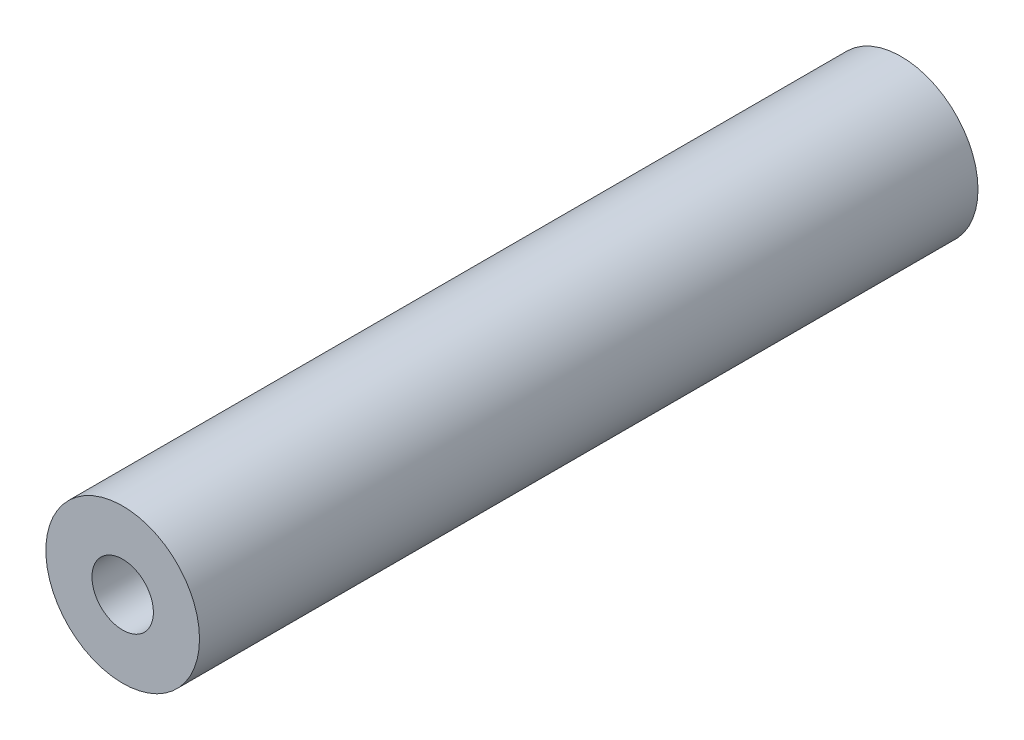
ISO-10303-21;
HEADER;
FILE_DESCRIPTION(('STEP AP214'),'2;1');
FILE_NAME('part.step','',(''),(''),'','','');
FILE_SCHEMA(('AUTOMOTIVE_DESIGN { 1 0 10303 214 1 1 1 1 }'));
ENDSEC;
DATA;
#1=APPLICATION_CONTEXT('core data for automotive mechanical design processes');
#2=APPLICATION_PROTOCOL_DEFINITION('international standard','automotive_design',2000,#1);
#3=PRODUCT_CONTEXT('',#1,'mechanical');
#4=PRODUCT('Part','Part','',(#3));
#5=PRODUCT_RELATED_PRODUCT_CATEGORY('part','',(#4));
#6=PRODUCT_DEFINITION_FORMATION('','',#4);
#7=PRODUCT_DEFINITION_CONTEXT('part definition',#1,'design');
#8=PRODUCT_DEFINITION('design','',#6,#7);
#9=PRODUCT_DEFINITION_SHAPE('','',#8);
#10=(LENGTH_UNIT() NAMED_UNIT(*) SI_UNIT(.MILLI.,.METRE.));
#11=(NAMED_UNIT(*) PLANE_ANGLE_UNIT() SI_UNIT($,.RADIAN.));
#12=(NAMED_UNIT(*) SI_UNIT($,.STERADIAN.) SOLID_ANGLE_UNIT());
#13=UNCERTAINTY_MEASURE_WITH_UNIT(LENGTH_MEASURE(1.E-05),#10,'distance_accuracy_value','');
#14=(GEOMETRIC_REPRESENTATION_CONTEXT(3) GLOBAL_UNCERTAINTY_ASSIGNED_CONTEXT((#13)) GLOBAL_UNIT_ASSIGNED_CONTEXT((#10,
#11,#12)) REPRESENTATION_CONTEXT('',''));
#15=CARTESIAN_POINT('',(0.,0.,0.));
#16=DIRECTION('',(0.,0.,1.));
#17=DIRECTION('',(1.,0.,0.));
#18=AXIS2_PLACEMENT_3D('',#15,#16,#17);
#19=CARTESIAN_POINT('',(0.,0.,152.));
#20=DIRECTION('',(0.,0.,-1.));
#21=DIRECTION('',(-1.,0.,0.));
#22=AXIS2_PLACEMENT_3D('',#19,#20,#21);
#23=CYLINDRICAL_SURFACE('',#22,15.);
#24=CARTESIAN_POINT('',(0.,0.,152.));
#25=DIRECTION('',(0.,0.,1.));
#26=DIRECTION('',(1.,0.,0.));
#27=AXIS2_PLACEMENT_3D('',#24,#25,#26);
#28=CIRCLE('',#27,15.);
#29=CARTESIAN_POINT('',(15.,0.,152.));
#30=VERTEX_POINT('',#29);
#31=EDGE_CURVE('E10',#30,#30,#28,.T.);
#32=ORIENTED_EDGE('',*,*,#31,.F.);
#33=EDGE_LOOP('',(#32));
#34=FACE_BOUND('',#33,.T.);
#35=CARTESIAN_POINT('',(0.,0.,0.));
#36=DIRECTION('',(0.,0.,1.));
#37=DIRECTION('',(1.,0.,0.));
#38=AXIS2_PLACEMENT_3D('',#35,#36,#37);
#39=CIRCLE('',#38,15.);
#40=CARTESIAN_POINT('',(15.,0.,0.));
#41=VERTEX_POINT('',#40);
#42=EDGE_CURVE('E34',#41,#41,#39,.T.);
#43=ORIENTED_EDGE('',*,*,#42,.T.);
#44=EDGE_LOOP('',(#43));
#45=FACE_BOUND('',#44,.T.);
#46=ADVANCED_FACE('F31',(#34,#45),#23,.T.);
#47=CARTESIAN_POINT('',(0.,0.,152.));
#48=DIRECTION('',(0.,0.,1.));
#49=DIRECTION('',(1.,0.,0.));
#50=AXIS2_PLACEMENT_3D('',#47,#48,#49);
#51=PLANE('',#50);
#52=CARTESIAN_POINT('',(0.,0.,152.));
#53=DIRECTION('',(0.,0.,1.));
#54=DIRECTION('',(1.,0.,0.));
#55=AXIS2_PLACEMENT_3D('',#52,#53,#54);
#56=CIRCLE('',#55,6.);
#57=CARTESIAN_POINT('',(6.,0.,152.));
#58=VERTEX_POINT('',#57);
#59=EDGE_CURVE('E49',#58,#58,#56,.T.);
#60=ORIENTED_EDGE('',*,*,#59,.F.);
#61=EDGE_LOOP('',(#60));
#62=FACE_BOUND('',#61,.T.);
#63=ORIENTED_EDGE('',*,*,#31,.T.);
#64=EDGE_LOOP('',(#63));
#65=FACE_BOUND('',#64,.T.);
#66=ADVANCED_FACE('F64',(#62,#65),#51,.T.);
#67=CARTESIAN_POINT('',(0.,0.,0.));
#68=DIRECTION('',(0.,0.,1.));
#69=DIRECTION('',(1.,0.,0.));
#70=AXIS2_PLACEMENT_3D('',#67,#68,#69);
#71=PLANE('',#70);
#72=CARTESIAN_POINT('',(0.,0.,0.));
#73=DIRECTION('',(0.,0.,-1.));
#74=DIRECTION('',(-1.,0.,0.));
#75=AXIS2_PLACEMENT_3D('',#72,#73,#74);
#76=CIRCLE('',#75,6.);
#77=CARTESIAN_POINT('',(-6.,0.,0.));
#78=VERTEX_POINT('',#77);
#79=EDGE_CURVE('E43',#78,#78,#76,.T.);
#80=ORIENTED_EDGE('',*,*,#79,.F.);
#81=EDGE_LOOP('',(#80));
#82=FACE_BOUND('',#81,.T.);
#83=ORIENTED_EDGE('',*,*,#42,.F.);
#84=EDGE_LOOP('',(#83));
#85=FACE_BOUND('',#84,.T.);
#86=ADVANCED_FACE('F66',(#82,#85),#71,.F.);
#87=CARTESIAN_POINT('',(0.,0.,55.));
#88=DIRECTION('',(0.,0.,-1.));
#89=DIRECTION('',(-1.,0.,0.));
#90=AXIS2_PLACEMENT_3D('',#87,#88,#89);
#91=CYLINDRICAL_SURFACE('',#90,6.);
#92=CARTESIAN_POINT('',(0.,0.,55.));
#93=DIRECTION('',(0.,0.,-1.));
#94=DIRECTION('',(-1.,0.,0.));
#95=AXIS2_PLACEMENT_3D('',#92,#93,#94);
#96=CIRCLE('',#95,6.);
#97=CARTESIAN_POINT('',(-6.,0.,55.));
#98=VERTEX_POINT('',#97);
#99=EDGE_CURVE('E41',#98,#98,#96,.T.);
#100=ORIENTED_EDGE('',*,*,#99,.F.);
#101=EDGE_LOOP('',(#100));
#102=FACE_BOUND('',#101,.T.);
#103=ORIENTED_EDGE('',*,*,#79,.T.);
#104=EDGE_LOOP('',(#103));
#105=FACE_BOUND('',#104,.T.);
#106=ADVANCED_FACE('F72',(#102,#105),#91,.F.);
#107=CARTESIAN_POINT('',(0.,0.,55.));
#108=DIRECTION('',(0.,0.,-1.));
#109=DIRECTION('',(-1.,0.,0.));
#110=AXIS2_PLACEMENT_3D('',#107,#108,#109);
#111=PLANE('',#110);
#112=ORIENTED_EDGE('',*,*,#99,.T.);
#113=EDGE_LOOP('',(#112));
#114=FACE_BOUND('',#113,.T.);
#115=ADVANCED_FACE('F60',(#114),#111,.T.);
#116=CARTESIAN_POINT('',(0.,0.,97.));
#117=DIRECTION('',(0.,0.,1.));
#118=DIRECTION('',(1.,0.,0.));
#119=AXIS2_PLACEMENT_3D('',#116,#117,#118);
#120=CYLINDRICAL_SURFACE('',#119,6.);
#121=CARTESIAN_POINT('',(0.,0.,97.));
#122=DIRECTION('',(0.,0.,1.));
#123=DIRECTION('',(1.,0.,0.));
#124=AXIS2_PLACEMENT_3D('',#121,#122,#123);
#125=CIRCLE('',#124,6.);
#126=CARTESIAN_POINT('',(6.,0.,97.));
#127=VERTEX_POINT('',#126);
#128=EDGE_CURVE('E46',#127,#127,#125,.T.);
#129=ORIENTED_EDGE('',*,*,#128,.F.);
#130=EDGE_LOOP('',(#129));
#131=FACE_BOUND('',#130,.T.);
#132=ORIENTED_EDGE('',*,*,#59,.T.);
#133=EDGE_LOOP('',(#132));
#134=FACE_BOUND('',#133,.T.);
#135=ADVANCED_FACE('F57',(#131,#134),#120,.F.);
#136=CARTESIAN_POINT('',(0.,0.,97.));
#137=DIRECTION('',(0.,0.,1.));
#138=DIRECTION('',(1.,0.,0.));
#139=AXIS2_PLACEMENT_3D('',#136,#137,#138);
#140=PLANE('',#139);
#141=ORIENTED_EDGE('',*,*,#128,.T.);
#142=EDGE_LOOP('',(#141));
#143=FACE_BOUND('',#142,.T.);
#144=ADVANCED_FACE('F55',(#143),#140,.T.);
#145=CLOSED_SHELL('',(#46,#66,#86,#106,#115,#135,#144));
#146=MANIFOLD_SOLID_BREP('B2',#145);
#147=ADVANCED_BREP_SHAPE_REPRESENTATION('',(#18,#146),#14);
#148=SHAPE_DEFINITION_REPRESENTATION(#9,#147);
ENDSEC;
END-ISO-10303-21;
